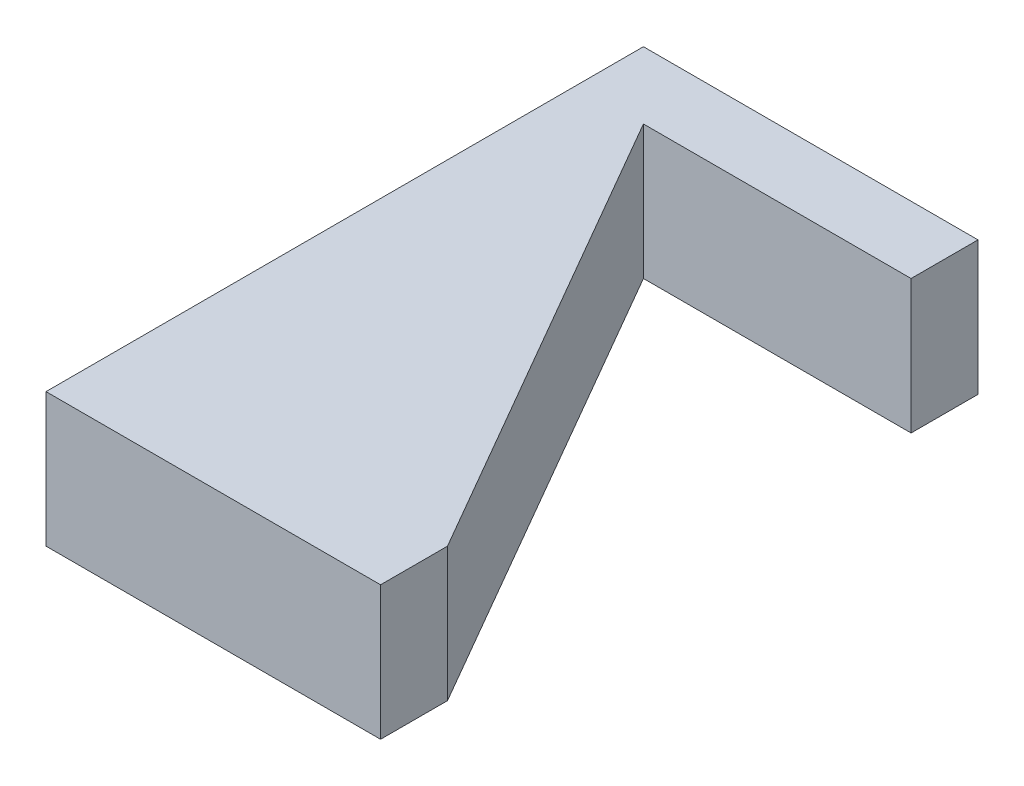
ISO-10303-21;
HEADER;
FILE_DESCRIPTION(('STEP AP214'),'2;1');
FILE_NAME('part.step','',(''),(''),'','','');
FILE_SCHEMA(('AUTOMOTIVE_DESIGN { 1 0 10303 214 1 1 1 1 }'));
ENDSEC;
DATA;
#1=APPLICATION_CONTEXT('core data for automotive mechanical design processes');
#2=APPLICATION_PROTOCOL_DEFINITION('international standard','automotive_design',2000,#1);
#3=PRODUCT_CONTEXT('',#1,'mechanical');
#4=PRODUCT('Part','Part','',(#3));
#5=PRODUCT_RELATED_PRODUCT_CATEGORY('part','',(#4));
#6=PRODUCT_DEFINITION_FORMATION('','',#4);
#7=PRODUCT_DEFINITION_CONTEXT('part definition',#1,'design');
#8=PRODUCT_DEFINITION('design','',#6,#7);
#9=PRODUCT_DEFINITION_SHAPE('','',#8);
#10=(LENGTH_UNIT() NAMED_UNIT(*) SI_UNIT(.MILLI.,.METRE.));
#11=(NAMED_UNIT(*) PLANE_ANGLE_UNIT() SI_UNIT($,.RADIAN.));
#12=(NAMED_UNIT(*) SI_UNIT($,.STERADIAN.) SOLID_ANGLE_UNIT());
#13=UNCERTAINTY_MEASURE_WITH_UNIT(LENGTH_MEASURE(1.E-05),#10,'distance_accuracy_value','');
#14=(GEOMETRIC_REPRESENTATION_CONTEXT(3) GLOBAL_UNCERTAINTY_ASSIGNED_CONTEXT((#13)) GLOBAL_UNIT_ASSIGNED_CONTEXT((#10,
#11,#12)) REPRESENTATION_CONTEXT('',''));
#15=CARTESIAN_POINT('',(0.,0.,0.));
#16=DIRECTION('',(0.,0.,1.));
#17=DIRECTION('',(1.,0.,0.));
#18=AXIS2_PLACEMENT_3D('',#15,#16,#17);
#19=CARTESIAN_POINT('',(10.,20.,10.));
#20=DIRECTION('',(0.,0.,-1.));
#21=DIRECTION('',(-1.,0.,0.));
#22=AXIS2_PLACEMENT_3D('',#19,#20,#21);
#23=PLANE('',#22);
#24=DIRECTION('',(1.,0.,0.));
#25=VECTOR('',#24,1.);
#26=CARTESIAN_POINT('',(10.,0.,10.));
#27=LINE('',#26,#25);
#28=CARTESIAN_POINT('',(10.,0.,10.));
#29=VERTEX_POINT('',#28);
#30=CARTESIAN_POINT('',(50.,0.,10.));
#31=VERTEX_POINT('',#30);
#32=EDGE_CURVE('E128',#29,#31,#27,.T.);
#33=ORIENTED_EDGE('',*,*,#32,.T.);
#34=DIRECTION('',(0.,-1.,0.));
#35=VECTOR('',#34,1.);
#36=CARTESIAN_POINT('',(50.,20.,10.));
#37=LINE('',#36,#35);
#38=CARTESIAN_POINT('',(50.,20.,10.));
#39=VERTEX_POINT('',#38);
#40=EDGE_CURVE('E11',#39,#31,#37,.T.);
#41=ORIENTED_EDGE('',*,*,#40,.F.);
#42=DIRECTION('',(1.,0.,0.));
#43=VECTOR('',#42,1.);
#44=CARTESIAN_POINT('',(10.,20.,10.));
#45=LINE('',#44,#43);
#46=CARTESIAN_POINT('',(10.,20.,10.));
#47=VERTEX_POINT('',#46);
#48=EDGE_CURVE('E142',#47,#39,#45,.T.);
#49=ORIENTED_EDGE('',*,*,#48,.F.);
#50=DIRECTION('',(0.,-1.,0.));
#51=VECTOR('',#50,1.);
#52=CARTESIAN_POINT('',(10.,20.,10.));
#53=LINE('',#52,#51);
#54=EDGE_CURVE('E53',#47,#29,#53,.T.);
#55=ORIENTED_EDGE('',*,*,#54,.T.);
#56=EDGE_LOOP('',(#33,#41,#49,#55));
#57=FACE_BOUND('',#56,.T.);
#58=ADVANCED_FACE('F37',(#57),#23,.F.);
#59=CARTESIAN_POINT('',(50.,20.,10.));
#60=DIRECTION('',(-1.,0.,0.));
#61=DIRECTION('',(0.,0.,1.));
#62=AXIS2_PLACEMENT_3D('',#59,#60,#61);
#63=PLANE('',#62);
#64=DIRECTION('',(0.,0.,-1.));
#65=VECTOR('',#64,1.);
#66=CARTESIAN_POINT('',(50.,0.,10.));
#67=LINE('',#66,#65);
#68=CARTESIAN_POINT('',(50.,0.,0.));
#69=VERTEX_POINT('',#68);
#70=EDGE_CURVE('E130',#31,#69,#67,.T.);
#71=ORIENTED_EDGE('',*,*,#70,.T.);
#72=DIRECTION('',(0.,-1.,0.));
#73=VECTOR('',#72,1.);
#74=CARTESIAN_POINT('',(50.,20.,0.));
#75=LINE('',#74,#73);
#76=CARTESIAN_POINT('',(50.,20.,0.));
#77=VERTEX_POINT('',#76);
#78=EDGE_CURVE('E45',#77,#69,#75,.T.);
#79=ORIENTED_EDGE('',*,*,#78,.F.);
#80=DIRECTION('',(0.,0.,-1.));
#81=VECTOR('',#80,1.);
#82=CARTESIAN_POINT('',(50.,20.,10.));
#83=LINE('',#82,#81);
#84=EDGE_CURVE('E89',#39,#77,#83,.T.);
#85=ORIENTED_EDGE('',*,*,#84,.F.);
#86=ORIENTED_EDGE('',*,*,#40,.T.);
#87=EDGE_LOOP('',(#71,#79,#85,#86));
#88=FACE_BOUND('',#87,.T.);
#89=ADVANCED_FACE('F164',(#88),#63,.F.);
#90=CARTESIAN_POINT('',(50.,20.,0.));
#91=DIRECTION('',(0.,0.,1.));
#92=DIRECTION('',(1.,0.,0.));
#93=AXIS2_PLACEMENT_3D('',#90,#91,#92);
#94=PLANE('',#93);
#95=DIRECTION('',(-1.,0.,0.));
#96=VECTOR('',#95,1.);
#97=CARTESIAN_POINT('',(50.,0.,0.));
#98=LINE('',#97,#96);
#99=CARTESIAN_POINT('',(0.,0.,0.));
#100=VERTEX_POINT('',#99);
#101=EDGE_CURVE('E132',#69,#100,#98,.T.);
#102=ORIENTED_EDGE('',*,*,#101,.T.);
#103=DIRECTION('',(0.,-1.,0.));
#104=VECTOR('',#103,1.);
#105=CARTESIAN_POINT('',(0.,20.,0.));
#106=LINE('',#105,#104);
#107=CARTESIAN_POINT('',(0.,20.,0.));
#108=VERTEX_POINT('',#107);
#109=EDGE_CURVE('E146',#108,#100,#106,.T.);
#110=ORIENTED_EDGE('',*,*,#109,.F.);
#111=DIRECTION('',(-1.,0.,0.));
#112=VECTOR('',#111,1.);
#113=CARTESIAN_POINT('',(50.,20.,0.));
#114=LINE('',#113,#112);
#115=EDGE_CURVE('E154',#77,#108,#114,.T.);
#116=ORIENTED_EDGE('',*,*,#115,.F.);
#117=ORIENTED_EDGE('',*,*,#78,.T.);
#118=EDGE_LOOP('',(#102,#110,#116,#117));
#119=FACE_BOUND('',#118,.T.);
#120=ADVANCED_FACE('F152',(#119),#94,.F.);
#121=CARTESIAN_POINT('',(0.,20.,0.));
#122=DIRECTION('',(1.,0.,0.));
#123=DIRECTION('',(0.,0.,-1.));
#124=AXIS2_PLACEMENT_3D('',#121,#122,#123);
#125=PLANE('',#124);
#126=DIRECTION('',(0.,0.,1.));
#127=VECTOR('',#126,1.);
#128=CARTESIAN_POINT('',(0.,0.,0.));
#129=LINE('',#128,#127);
#130=CARTESIAN_POINT('',(0.,0.,89.2820323027554));
#131=VERTEX_POINT('',#130);
#132=EDGE_CURVE('E134',#100,#131,#129,.T.);
#133=ORIENTED_EDGE('',*,*,#132,.T.);
#134=DIRECTION('',(0.,-1.,0.));
#135=VECTOR('',#134,1.);
#136=CARTESIAN_POINT('',(0.,20.,89.2820323027554));
#137=LINE('',#136,#135);
#138=CARTESIAN_POINT('',(0.,20.,89.2820323027554));
#139=VERTEX_POINT('',#138);
#140=EDGE_CURVE('E120',#139,#131,#137,.T.);
#141=ORIENTED_EDGE('',*,*,#140,.F.);
#142=DIRECTION('',(0.,0.,1.));
#143=VECTOR('',#142,1.);
#144=CARTESIAN_POINT('',(0.,20.,0.));
#145=LINE('',#144,#143);
#146=EDGE_CURVE('E108',#108,#139,#145,.T.);
#147=ORIENTED_EDGE('',*,*,#146,.F.);
#148=ORIENTED_EDGE('',*,*,#109,.T.);
#149=EDGE_LOOP('',(#133,#141,#147,#148));
#150=FACE_BOUND('',#149,.T.);
#151=ADVANCED_FACE('F159',(#150),#125,.F.);
#152=CARTESIAN_POINT('',(0.,20.,89.2820323027554));
#153=DIRECTION('',(0.,0.,-1.));
#154=DIRECTION('',(-1.,0.,0.));
#155=AXIS2_PLACEMENT_3D('',#152,#153,#154);
#156=PLANE('',#155);
#157=DIRECTION('',(1.,0.,0.));
#158=VECTOR('',#157,1.);
#159=CARTESIAN_POINT('',(0.,0.,89.2820323027554));
#160=LINE('',#159,#158);
#161=CARTESIAN_POINT('',(50.,0.,89.2820323027554));
#162=VERTEX_POINT('',#161);
#163=EDGE_CURVE('E117',#131,#162,#160,.T.);
#164=ORIENTED_EDGE('',*,*,#163,.T.);
#165=DIRECTION('',(0.,-1.,0.));
#166=VECTOR('',#165,1.);
#167=CARTESIAN_POINT('',(50.,20.,89.2820323027554));
#168=LINE('',#167,#166);
#169=CARTESIAN_POINT('',(50.,20.,89.2820323027554));
#170=VERTEX_POINT('',#169);
#171=EDGE_CURVE('E114',#170,#162,#168,.T.);
#172=ORIENTED_EDGE('',*,*,#171,.F.);
#173=DIRECTION('',(1.,0.,0.));
#174=VECTOR('',#173,1.);
#175=CARTESIAN_POINT('',(0.,20.,89.2820323027554));
#176=LINE('',#175,#174);
#177=EDGE_CURVE('E101',#139,#170,#176,.T.);
#178=ORIENTED_EDGE('',*,*,#177,.F.);
#179=ORIENTED_EDGE('',*,*,#140,.T.);
#180=EDGE_LOOP('',(#164,#172,#178,#179));
#181=FACE_BOUND('',#180,.T.);
#182=ADVANCED_FACE('F115',(#181),#156,.F.);
#183=CARTESIAN_POINT('',(50.,20.,89.2820323027554));
#184=DIRECTION('',(-1.,0.,0.));
#185=DIRECTION('',(0.,0.,1.));
#186=AXIS2_PLACEMENT_3D('',#183,#184,#185);
#187=PLANE('',#186);
#188=DIRECTION('',(0.,0.,-1.));
#189=VECTOR('',#188,1.);
#190=CARTESIAN_POINT('',(50.,0.,89.2820323027554));
#191=LINE('',#190,#189);
#192=CARTESIAN_POINT('',(50.,0.,79.2820323027555));
#193=VERTEX_POINT('',#192);
#194=EDGE_CURVE('E137',#162,#193,#191,.T.);
#195=ORIENTED_EDGE('',*,*,#194,.T.);
#196=DIRECTION('',(0.,-1.,0.));
#197=VECTOR('',#196,1.);
#198=CARTESIAN_POINT('',(50.,20.,79.2820323027555));
#199=LINE('',#198,#197);
#200=CARTESIAN_POINT('',(50.,20.,79.2820323027555));
#201=VERTEX_POINT('',#200);
#202=EDGE_CURVE('E77',#201,#193,#199,.T.);
#203=ORIENTED_EDGE('',*,*,#202,.F.);
#204=DIRECTION('',(0.,0.,-1.));
#205=VECTOR('',#204,1.);
#206=CARTESIAN_POINT('',(50.,20.,89.2820323027554));
#207=LINE('',#206,#205);
#208=EDGE_CURVE('E106',#170,#201,#207,.T.);
#209=ORIENTED_EDGE('',*,*,#208,.F.);
#210=ORIENTED_EDGE('',*,*,#171,.T.);
#211=EDGE_LOOP('',(#195,#203,#209,#210));
#212=FACE_BOUND('',#211,.T.);
#213=ADVANCED_FACE('F122',(#212),#187,.F.);
#214=CARTESIAN_POINT('',(10.,20.,10.));
#215=DIRECTION('',(0.86602540378444,0.,-0.499999999999998));
#216=DIRECTION('',(-0.499999999999998,0.,-0.86602540378444));
#217=AXIS2_PLACEMENT_3D('',#214,#215,#216);
#218=PLANE('',#217);
#219=DIRECTION('',(0.499999999999998,0.,0.86602540378444));
#220=VECTOR('',#219,1.);
#221=CARTESIAN_POINT('',(10.,0.,10.));
#222=LINE('',#221,#220);
#223=EDGE_CURVE('E139',#29,#193,#222,.T.);
#224=ORIENTED_EDGE('',*,*,#223,.F.);
#225=ORIENTED_EDGE('',*,*,#54,.F.);
#226=DIRECTION('',(0.499999999999998,0.,0.86602540378444));
#227=VECTOR('',#226,1.);
#228=CARTESIAN_POINT('',(10.,20.,10.));
#229=LINE('',#228,#227);
#230=EDGE_CURVE('E123',#47,#201,#229,.T.);
#231=ORIENTED_EDGE('',*,*,#230,.T.);
#232=ORIENTED_EDGE('',*,*,#202,.T.);
#233=EDGE_LOOP('',(#224,#225,#231,#232));
#234=FACE_BOUND('',#233,.T.);
#235=ADVANCED_FACE('F178',(#234),#218,.T.);
#236=CARTESIAN_POINT('',(0.,20.,0.));
#237=DIRECTION('',(0.,1.,0.));
#238=DIRECTION('',(0.,0.,1.));
#239=AXIS2_PLACEMENT_3D('',#236,#237,#238);
#240=PLANE('',#239);
#241=ORIENTED_EDGE('',*,*,#48,.T.);
#242=ORIENTED_EDGE('',*,*,#84,.T.);
#243=ORIENTED_EDGE('',*,*,#115,.T.);
#244=ORIENTED_EDGE('',*,*,#146,.T.);
#245=ORIENTED_EDGE('',*,*,#177,.T.);
#246=ORIENTED_EDGE('',*,*,#208,.T.);
#247=ORIENTED_EDGE('',*,*,#230,.F.);
#248=EDGE_LOOP('',(#241,#242,#243,#244,#245,#246,#247));
#249=FACE_BOUND('',#248,.T.);
#250=ADVANCED_FACE('F103',(#249),#240,.T.);
#251=CARTESIAN_POINT('',(0.,0.,0.));
#252=DIRECTION('',(0.,1.,0.));
#253=DIRECTION('',(0.,0.,1.));
#254=AXIS2_PLACEMENT_3D('',#251,#252,#253);
#255=PLANE('',#254);
#256=ORIENTED_EDGE('',*,*,#32,.F.);
#257=ORIENTED_EDGE('',*,*,#223,.T.);
#258=ORIENTED_EDGE('',*,*,#194,.F.);
#259=ORIENTED_EDGE('',*,*,#163,.F.);
#260=ORIENTED_EDGE('',*,*,#132,.F.);
#261=ORIENTED_EDGE('',*,*,#101,.F.);
#262=ORIENTED_EDGE('',*,*,#70,.F.);
#263=EDGE_LOOP('',(#256,#257,#258,#259,#260,#261,#262));
#264=FACE_BOUND('',#263,.T.);
#265=ADVANCED_FACE('F157',(#264),#255,.F.);
#266=CLOSED_SHELL('',(#58,#89,#120,#151,#182,#213,#235,#250,#265));
#267=MANIFOLD_SOLID_BREP('B2',#266);
#268=ADVANCED_BREP_SHAPE_REPRESENTATION('',(#18,#267),#14);
#269=SHAPE_DEFINITION_REPRESENTATION(#9,#268);
ENDSEC;
END-ISO-10303-21;
